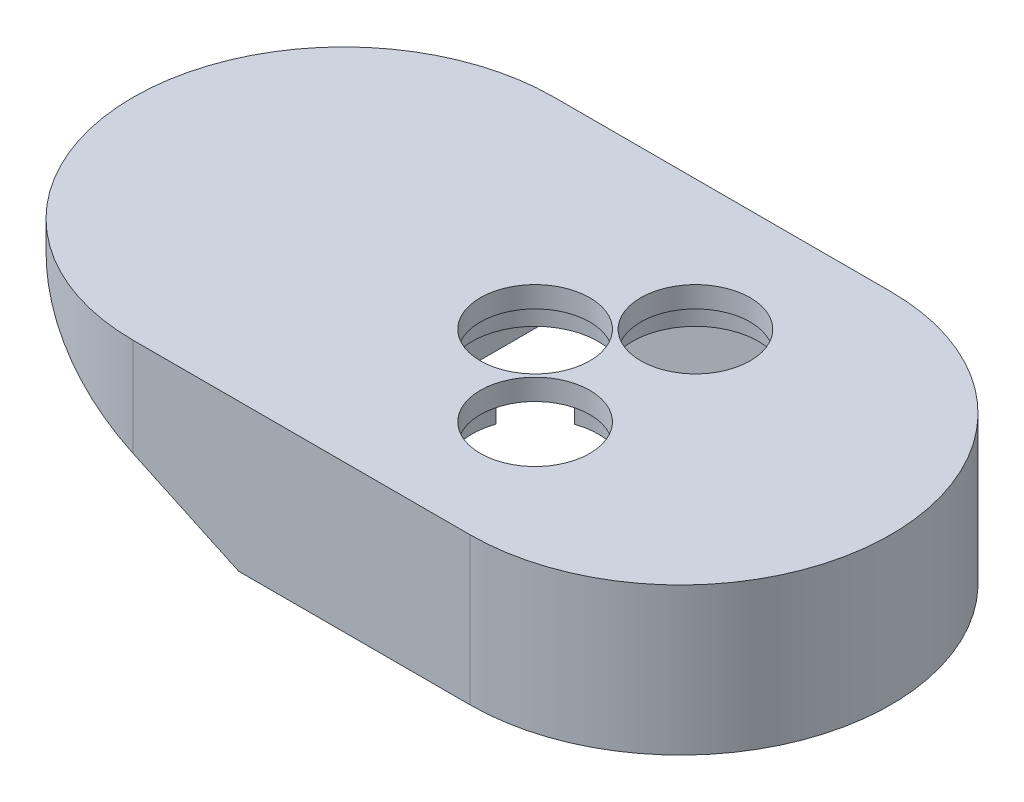
ISO-10303-21;
HEADER;
FILE_DESCRIPTION(('STEP AP214'),'2;1');
FILE_NAME('part.step','',(''),(''),'','','');
FILE_SCHEMA(('AUTOMOTIVE_DESIGN { 1 0 10303 214 1 1 1 1 }'));
ENDSEC;
DATA;
#1=APPLICATION_CONTEXT('core data for automotive mechanical design processes');
#2=APPLICATION_PROTOCOL_DEFINITION('international standard','automotive_design',2000,#1);
#3=PRODUCT_CONTEXT('',#1,'mechanical');
#4=PRODUCT('Part','Part','',(#3));
#5=PRODUCT_RELATED_PRODUCT_CATEGORY('part','',(#4));
#6=PRODUCT_DEFINITION_FORMATION('','',#4);
#7=PRODUCT_DEFINITION_CONTEXT('part definition',#1,'design');
#8=PRODUCT_DEFINITION('design','',#6,#7);
#9=PRODUCT_DEFINITION_SHAPE('','',#8);
#10=(LENGTH_UNIT() NAMED_UNIT(*) SI_UNIT(.MILLI.,.METRE.));
#11=(NAMED_UNIT(*) PLANE_ANGLE_UNIT() SI_UNIT($,.RADIAN.));
#12=(NAMED_UNIT(*) SI_UNIT($,.STERADIAN.) SOLID_ANGLE_UNIT());
#13=UNCERTAINTY_MEASURE_WITH_UNIT(LENGTH_MEASURE(1.E-05),#10,'distance_accuracy_value','');
#14=(GEOMETRIC_REPRESENTATION_CONTEXT(3) GLOBAL_UNCERTAINTY_ASSIGNED_CONTEXT((#13)) GLOBAL_UNIT_ASSIGNED_CONTEXT((#10,
#11,#12)) REPRESENTATION_CONTEXT('',''));
#15=CARTESIAN_POINT('',(0.,0.,0.));
#16=DIRECTION('',(0.,0.,1.));
#17=DIRECTION('',(1.,0.,0.));
#18=AXIS2_PLACEMENT_3D('',#15,#16,#17);
#19=CARTESIAN_POINT('',(0.,2.,-10.));
#20=DIRECTION('',(0.,0.,1.));
#21=DIRECTION('',(1.,0.,0.));
#22=AXIS2_PLACEMENT_3D('',#19,#20,#21);
#23=PLANE('',#22);
#24=DIRECTION('',(0.906307787036651,-0.422618261740697,0.));
#25=VECTOR('',#24,1.);
#26=CARTESIAN_POINT('',(-3.87771663095597,-8.31579015086013,-10.));
#27=LINE('',#26,#25);
#28=CARTESIAN_POINT('',(-16.,-2.66307658154996,-10.));
#29=VERTEX_POINT('',#28);
#30=CARTESIAN_POINT('',(-10.988451556433,-5.,-10.));
#31=VERTEX_POINT('',#30);
#32=EDGE_CURVE('E149',#29,#31,#27,.T.);
#33=ORIENTED_EDGE('',*,*,#32,.F.);
#34=DIRECTION('',(0.,1.,0.));
#35=VECTOR('',#34,1.);
#36=CARTESIAN_POINT('',(-16.,-35.6668415320195,-10.));
#37=LINE('',#36,#35);
#38=CARTESIAN_POINT('',(-16.,2.,-10.));
#39=VERTEX_POINT('',#38);
#40=EDGE_CURVE('E189',#29,#39,#37,.T.);
#41=ORIENTED_EDGE('',*,*,#40,.T.);
#42=DIRECTION('',(-1.,0.,0.));
#43=VECTOR('',#42,1.);
#44=CARTESIAN_POINT('',(0.,2.,-10.));
#45=LINE('',#44,#43);
#46=CARTESIAN_POINT('',(0.,2.,-10.));
#47=VERTEX_POINT('',#46);
#48=EDGE_CURVE('E273',#47,#39,#45,.T.);
#49=ORIENTED_EDGE('',*,*,#48,.F.);
#50=DIRECTION('',(0.,-1.,0.));
#51=VECTOR('',#50,1.);
#52=CARTESIAN_POINT('',(0.,2.,-10.));
#53=LINE('',#52,#51);
#54=CARTESIAN_POINT('',(0.,-5.,-10.));
#55=VERTEX_POINT('',#54);
#56=EDGE_CURVE('E12',#47,#55,#53,.T.);
#57=ORIENTED_EDGE('',*,*,#56,.T.);
#58=DIRECTION('',(1.,0.,0.));
#59=VECTOR('',#58,1.);
#60=CARTESIAN_POINT('',(-10.,-5.,-10.));
#61=LINE('',#60,#59);
#62=EDGE_CURVE('E147',#31,#55,#61,.T.);
#63=ORIENTED_EDGE('',*,*,#62,.F.);
#64=EDGE_LOOP('',(#33,#41,#49,#57,#63));
#65=FACE_BOUND('',#64,.T.);
#66=ADVANCED_FACE('F43',(#65),#23,.F.);
#67=CARTESIAN_POINT('',(0.,2.,10.));
#68=DIRECTION('',(0.,0.,-1.));
#69=DIRECTION('',(-1.,0.,0.));
#70=AXIS2_PLACEMENT_3D('',#67,#68,#69);
#71=PLANE('',#70);
#72=DIRECTION('',(0.906307787036651,-0.422618261740697,0.));
#73=VECTOR('',#72,1.);
#74=CARTESIAN_POINT('',(-3.87771663095597,-8.31579015086013,10.));
#75=LINE('',#74,#73);
#76=CARTESIAN_POINT('',(-16.,-2.66307658154996,10.));
#77=VERTEX_POINT('',#76);
#78=CARTESIAN_POINT('',(-10.988451556433,-5.,10.));
#79=VERTEX_POINT('',#78);
#80=EDGE_CURVE('E166',#77,#79,#75,.T.);
#81=ORIENTED_EDGE('',*,*,#80,.T.);
#82=DIRECTION('',(-1.,0.,0.));
#83=VECTOR('',#82,1.);
#84=CARTESIAN_POINT('',(0.,-5.,10.));
#85=LINE('',#84,#83);
#86=CARTESIAN_POINT('',(0.,-5.,10.));
#87=VERTEX_POINT('',#86);
#88=EDGE_CURVE('E156',#87,#79,#85,.T.);
#89=ORIENTED_EDGE('',*,*,#88,.F.);
#90=DIRECTION('',(0.,-1.,0.));
#91=VECTOR('',#90,1.);
#92=CARTESIAN_POINT('',(0.,2.,10.));
#93=LINE('',#92,#91);
#94=CARTESIAN_POINT('',(0.,2.,10.));
#95=VERTEX_POINT('',#94);
#96=EDGE_CURVE('E51',#95,#87,#93,.T.);
#97=ORIENTED_EDGE('',*,*,#96,.F.);
#98=DIRECTION('',(1.,0.,0.));
#99=VECTOR('',#98,1.);
#100=CARTESIAN_POINT('',(0.,2.,10.));
#101=LINE('',#100,#99);
#102=CARTESIAN_POINT('',(-16.,2.,10.));
#103=VERTEX_POINT('',#102);
#104=EDGE_CURVE('E276',#103,#95,#101,.T.);
#105=ORIENTED_EDGE('',*,*,#104,.F.);
#106=DIRECTION('',(0.,1.,0.));
#107=VECTOR('',#106,1.);
#108=CARTESIAN_POINT('',(-16.,-35.6668415320195,10.));
#109=LINE('',#108,#107);
#110=EDGE_CURVE('E190',#77,#103,#109,.T.);
#111=ORIENTED_EDGE('',*,*,#110,.F.);
#112=EDGE_LOOP('',(#81,#89,#97,#105,#111));
#113=FACE_BOUND('',#112,.T.);
#114=ADVANCED_FACE('F284',(#113),#71,.F.);
#115=CARTESIAN_POINT('',(0.,-5.,0.));
#116=DIRECTION('',(0.,-1.,0.));
#117=DIRECTION('',(0.,0.,-1.));
#118=AXIS2_PLACEMENT_3D('',#115,#116,#117);
#119=PLANE('',#118);
#120=DIRECTION('',(0.,0.,1.));
#121=VECTOR('',#120,1.);
#122=CARTESIAN_POINT('',(3.,-5.,8.));
#123=LINE('',#122,#121);
#124=CARTESIAN_POINT('',(3.00000000000001,-5.,-8.));
#125=VERTEX_POINT('',#124);
#126=CARTESIAN_POINT('',(3.,-5.,8.));
#127=VERTEX_POINT('',#126);
#128=EDGE_CURVE('E195',#125,#127,#123,.T.);
#129=ORIENTED_EDGE('',*,*,#128,.F.);
#130=DIRECTION('',(1.,0.,0.));
#131=VECTOR('',#130,1.);
#132=CARTESIAN_POINT('',(-13.,-5.,-8.));
#133=LINE('',#132,#131);
#134=CARTESIAN_POINT('',(-10.988451556433,-5.,-8.));
#135=VERTEX_POINT('',#134);
#136=EDGE_CURVE('E171',#135,#125,#133,.T.);
#137=ORIENTED_EDGE('',*,*,#136,.F.);
#138=DIRECTION('',(0.,0.,1.));
#139=VECTOR('',#138,1.);
#140=CARTESIAN_POINT('',(-10.988451556433,-5.,-10.));
#141=LINE('',#140,#139);
#142=EDGE_CURVE('E161',#31,#135,#141,.T.);
#143=ORIENTED_EDGE('',*,*,#142,.F.);
#144=ORIENTED_EDGE('',*,*,#62,.T.);
#145=CARTESIAN_POINT('',(0.,-5.,0.));
#146=DIRECTION('',(0.,-1.,0.));
#147=DIRECTION('',(0.,0.,-1.));
#148=AXIS2_PLACEMENT_3D('',#145,#146,#147);
#149=CIRCLE('',#148,10.);
#150=EDGE_CURVE('E219',#55,#87,#149,.T.);
#151=ORIENTED_EDGE('',*,*,#150,.T.);
#152=ORIENTED_EDGE('',*,*,#88,.T.);
#153=CARTESIAN_POINT('',(-10.988451556433,-5.,8.));
#154=VERTEX_POINT('',#153);
#155=EDGE_CURVE('E165',#154,#79,#141,.T.);
#156=ORIENTED_EDGE('',*,*,#155,.F.);
#157=DIRECTION('',(-1.,0.,0.));
#158=VECTOR('',#157,1.);
#159=CARTESIAN_POINT('',(-13.,-5.,8.));
#160=LINE('',#159,#158);
#161=EDGE_CURVE('E197',#127,#154,#160,.T.);
#162=ORIENTED_EDGE('',*,*,#161,.F.);
#163=EDGE_LOOP('',(#129,#137,#143,#144,#151,#152,#156,#162));
#164=FACE_BOUND('',#163,.T.);
#165=ADVANCED_FACE('F170',(#164),#119,.T.);
#166=CARTESIAN_POINT('',(-13.,-5.,8.));
#167=DIRECTION('',(0.,0.,-1.));
#168=DIRECTION('',(-1.,0.,0.));
#169=AXIS2_PLACEMENT_3D('',#166,#167,#168);
#170=PLANE('',#169);
#171=ORIENTED_EDGE('',*,*,#161,.T.);
#172=DIRECTION('',(-0.906307787036651,0.422618261740697,0.));
#173=VECTOR('',#172,1.);
#174=CARTESIAN_POINT('',(-12.6407249861211,-4.22953224637044,8.));
#175=LINE('',#174,#173);
#176=CARTESIAN_POINT('',(-13.,-4.06199955601494,8.));
#177=VERTEX_POINT('',#176);
#178=EDGE_CURVE('E182',#154,#177,#175,.T.);
#179=ORIENTED_EDGE('',*,*,#178,.T.);
#180=DIRECTION('',(0.,1.,0.));
#181=VECTOR('',#180,1.);
#182=CARTESIAN_POINT('',(-13.,-5.,8.));
#183=LINE('',#182,#181);
#184=CARTESIAN_POINT('',(-13.,0.,8.));
#185=VERTEX_POINT('',#184);
#186=EDGE_CURVE('E214',#177,#185,#183,.T.);
#187=ORIENTED_EDGE('',*,*,#186,.T.);
#188=DIRECTION('',(-1.,0.,0.));
#189=VECTOR('',#188,1.);
#190=CARTESIAN_POINT('',(-13.,0.,8.));
#191=LINE('',#190,#189);
#192=CARTESIAN_POINT('',(3.,0.,8.));
#193=VERTEX_POINT('',#192);
#194=EDGE_CURVE('E203',#193,#185,#191,.T.);
#195=ORIENTED_EDGE('',*,*,#194,.F.);
#196=DIRECTION('',(0.,1.,0.));
#197=VECTOR('',#196,1.);
#198=CARTESIAN_POINT('',(3.,-5.,8.));
#199=LINE('',#198,#197);
#200=EDGE_CURVE('E216',#127,#193,#199,.T.);
#201=ORIENTED_EDGE('',*,*,#200,.F.);
#202=EDGE_LOOP('',(#171,#179,#187,#195,#201));
#203=FACE_BOUND('',#202,.T.);
#204=ADVANCED_FACE('F292',(#203),#170,.T.);
#205=CARTESIAN_POINT('',(-13.,-5.,8.));
#206=DIRECTION('',(1.,0.,0.));
#207=DIRECTION('',(0.,0.,-1.));
#208=AXIS2_PLACEMENT_3D('',#205,#206,#207);
#209=PLANE('',#208);
#210=ORIENTED_EDGE('',*,*,#186,.F.);
#211=DIRECTION('',(0.,0.,-1.));
#212=VECTOR('',#211,1.);
#213=CARTESIAN_POINT('',(-13.,-4.06199955601494,8.));
#214=LINE('',#213,#212);
#215=CARTESIAN_POINT('',(-13.,-4.06199955601495,-8.));
#216=VERTEX_POINT('',#215);
#217=EDGE_CURVE('E179',#177,#216,#214,.T.);
#218=ORIENTED_EDGE('',*,*,#217,.T.);
#219=DIRECTION('',(0.,1.,0.));
#220=VECTOR('',#219,1.);
#221=CARTESIAN_POINT('',(-13.,-5.,-8.));
#222=LINE('',#221,#220);
#223=CARTESIAN_POINT('',(-13.,0.,-8.));
#224=VERTEX_POINT('',#223);
#225=EDGE_CURVE('E212',#216,#224,#222,.T.);
#226=ORIENTED_EDGE('',*,*,#225,.T.);
#227=DIRECTION('',(0.,0.,-1.));
#228=VECTOR('',#227,1.);
#229=CARTESIAN_POINT('',(-13.,0.,8.));
#230=LINE('',#229,#228);
#231=EDGE_CURVE('E206',#185,#224,#230,.T.);
#232=ORIENTED_EDGE('',*,*,#231,.F.);
#233=EDGE_LOOP('',(#210,#218,#226,#232));
#234=FACE_BOUND('',#233,.T.);
#235=ADVANCED_FACE('F296',(#234),#209,.T.);
#236=CARTESIAN_POINT('',(-13.,-5.,-8.));
#237=DIRECTION('',(0.,0.,1.));
#238=DIRECTION('',(1.,0.,0.));
#239=AXIS2_PLACEMENT_3D('',#236,#237,#238);
#240=PLANE('',#239);
#241=ORIENTED_EDGE('',*,*,#225,.F.);
#242=DIRECTION('',(0.906307787036651,-0.422618261740697,0.));
#243=VECTOR('',#242,1.);
#244=CARTESIAN_POINT('',(-12.6407249861211,-4.22953224637044,-8.));
#245=LINE('',#244,#243);
#246=EDGE_CURVE('E177',#216,#135,#245,.T.);
#247=ORIENTED_EDGE('',*,*,#246,.T.);
#248=ORIENTED_EDGE('',*,*,#136,.T.);
#249=DIRECTION('',(0.,1.,0.));
#250=VECTOR('',#249,1.);
#251=CARTESIAN_POINT('',(3.00000000000001,-5.,-8.));
#252=LINE('',#251,#250);
#253=CARTESIAN_POINT('',(3.00000000000001,0.,-8.));
#254=VERTEX_POINT('',#253);
#255=EDGE_CURVE('E58',#125,#254,#252,.T.);
#256=ORIENTED_EDGE('',*,*,#255,.T.);
#257=DIRECTION('',(1.,0.,0.));
#258=VECTOR('',#257,1.);
#259=CARTESIAN_POINT('',(-13.,0.,-8.));
#260=LINE('',#259,#258);
#261=EDGE_CURVE('E198',#224,#254,#260,.T.);
#262=ORIENTED_EDGE('',*,*,#261,.F.);
#263=EDGE_LOOP('',(#241,#247,#248,#256,#262));
#264=FACE_BOUND('',#263,.T.);
#265=ADVANCED_FACE('F303',(#264),#240,.T.);
#266=CARTESIAN_POINT('',(-16.,-35.6668415320195,0.));
#267=DIRECTION('',(0.,1.,0.));
#268=DIRECTION('',(0.,0.,1.));
#269=AXIS2_PLACEMENT_3D('',#266,#267,#268);
#270=CYLINDRICAL_SURFACE('',#269,10.);
#271=CARTESIAN_POINT('',(-16.,2.,0.));
#272=DIRECTION('',(0.,1.,0.));
#273=DIRECTION('',(0.,0.,1.));
#274=AXIS2_PLACEMENT_3D('',#271,#272,#273);
#275=CIRCLE('',#274,10.);
#276=CARTESIAN_POINT('',(-26.,1.99999999999999,0.));
#277=VERTEX_POINT('',#276);
#278=EDGE_CURVE('E185',#277,#103,#275,.T.);
#279=ORIENTED_EDGE('',*,*,#278,.F.);
#280=CARTESIAN_POINT('',(-16.,-2.66307658154996,0.));
#281=DIRECTION('',(-0.422618261740697,-0.906307787036651,0.));
#282=DIRECTION('',(-0.906307787036651,0.422618261740697,0.));
#283=AXIS2_PLACEMENT_3D('',#280,#281,#282);
#284=ELLIPSE('',#283,11.0337791896249,10.);
#285=EDGE_CURVE('E173',#277,#77,#284,.F.);
#286=ORIENTED_EDGE('',*,*,#285,.T.);
#287=ORIENTED_EDGE('',*,*,#110,.T.);
#288=EDGE_LOOP('',(#279,#286,#287));
#289=FACE_BOUND('',#288,.T.);
#290=ADVANCED_FACE('F305',(#289),#270,.T.);
#291=ORIENTED_EDGE('',*,*,#40,.F.);
#292=EDGE_CURVE('E164',#29,#277,#284,.F.);
#293=ORIENTED_EDGE('',*,*,#292,.T.);
#294=EDGE_CURVE('E186',#39,#277,#275,.T.);
#295=ORIENTED_EDGE('',*,*,#294,.F.);
#296=EDGE_LOOP('',(#291,#293,#295));
#297=FACE_BOUND('',#296,.T.);
#298=ADVANCED_FACE('F311',(#297),#270,.T.);
#299=CARTESIAN_POINT('',(-3.095,2.,3.80999999999999));
#300=DIRECTION('',(0.,-1.,0.));
#301=DIRECTION('',(0.,0.,-1.));
#302=AXIS2_PLACEMENT_3D('',#299,#300,#301);
#303=CYLINDRICAL_SURFACE('',#302,2.6);
#304=CARTESIAN_POINT('',(-3.095,2.,3.80999999999999));
#305=DIRECTION('',(0.,1.,0.));
#306=DIRECTION('',(0.,0.,1.));
#307=AXIS2_PLACEMENT_3D('',#304,#305,#306);
#308=CIRCLE('',#307,2.6);
#309=CARTESIAN_POINT('',(-3.095,2.,6.40999999999999));
#310=VERTEX_POINT('',#309);
#311=EDGE_CURVE('E267',#310,#310,#308,.T.);
#312=ORIENTED_EDGE('',*,*,#311,.T.);
#313=EDGE_LOOP('',(#312));
#314=FACE_BOUND('',#313,.T.);
#315=CARTESIAN_POINT('',(-3.095,1.,3.80999999999999));
#316=DIRECTION('',(0.,-1.,0.));
#317=DIRECTION('',(0.,0.,-1.));
#318=AXIS2_PLACEMENT_3D('',#315,#316,#317);
#319=CIRCLE('',#318,2.6);
#320=CARTESIAN_POINT('',(-3.095,1.,1.20999999999999));
#321=VERTEX_POINT('',#320);
#322=EDGE_CURVE('E229',#321,#321,#319,.F.);
#323=ORIENTED_EDGE('',*,*,#322,.F.);
#324=EDGE_LOOP('',(#323));
#325=FACE_BOUND('',#324,.T.);
#326=ADVANCED_FACE('F329',(#314,#325),#303,.F.);
#327=CARTESIAN_POINT('',(-3.095,2.,-3.81000000000001));
#328=DIRECTION('',(0.,-1.,0.));
#329=DIRECTION('',(0.,0.,-1.));
#330=AXIS2_PLACEMENT_3D('',#327,#328,#329);
#331=CYLINDRICAL_SURFACE('',#330,2.6);
#332=CARTESIAN_POINT('',(-3.095,2.,-3.81000000000001));
#333=DIRECTION('',(0.,1.,0.));
#334=DIRECTION('',(0.,0.,1.));
#335=AXIS2_PLACEMENT_3D('',#332,#333,#334);
#336=CIRCLE('',#335,2.6);
#337=CARTESIAN_POINT('',(-3.095,2.,-1.21000000000001));
#338=VERTEX_POINT('',#337);
#339=EDGE_CURVE('E264',#338,#338,#336,.T.);
#340=ORIENTED_EDGE('',*,*,#339,.T.);
#341=EDGE_LOOP('',(#340));
#342=FACE_BOUND('',#341,.T.);
#343=CARTESIAN_POINT('',(-3.095,1.,-3.81000000000001));
#344=DIRECTION('',(0.,-1.,0.));
#345=DIRECTION('',(0.,0.,-1.));
#346=AXIS2_PLACEMENT_3D('',#343,#344,#345);
#347=CIRCLE('',#346,2.6);
#348=CARTESIAN_POINT('',(-3.095,1.,-6.41000000000001));
#349=VERTEX_POINT('',#348);
#350=EDGE_CURVE('E222',#349,#349,#347,.F.);
#351=ORIENTED_EDGE('',*,*,#350,.F.);
#352=EDGE_LOOP('',(#351));
#353=FACE_BOUND('',#352,.T.);
#354=ADVANCED_FACE('F332',(#342,#353),#331,.F.);
#355=CARTESIAN_POINT('',(-6.905,2.,0.));
#356=DIRECTION('',(0.,-1.,0.));
#357=DIRECTION('',(0.,0.,-1.));
#358=AXIS2_PLACEMENT_3D('',#355,#356,#357);
#359=CYLINDRICAL_SURFACE('',#358,2.6);
#360=CARTESIAN_POINT('',(-6.905,2.,0.));
#361=DIRECTION('',(0.,1.,0.));
#362=DIRECTION('',(0.,0.,1.));
#363=AXIS2_PLACEMENT_3D('',#360,#361,#362);
#364=CIRCLE('',#363,2.6);
#365=CARTESIAN_POINT('',(-6.905,2.,2.60000000000001));
#366=VERTEX_POINT('',#365);
#367=EDGE_CURVE('E256',#366,#366,#364,.T.);
#368=ORIENTED_EDGE('',*,*,#367,.T.);
#369=EDGE_LOOP('',(#368));
#370=FACE_BOUND('',#369,.T.);
#371=CARTESIAN_POINT('',(-6.905,1.,0.));
#372=DIRECTION('',(0.,-1.,0.));
#373=DIRECTION('',(0.,0.,-1.));
#374=AXIS2_PLACEMENT_3D('',#371,#372,#373);
#375=CIRCLE('',#374,2.6);
#376=CARTESIAN_POINT('',(-6.905,1.,-2.59999999999999));
#377=VERTEX_POINT('',#376);
#378=EDGE_CURVE('E225',#377,#377,#375,.F.);
#379=ORIENTED_EDGE('',*,*,#378,.F.);
#380=EDGE_LOOP('',(#379));
#381=FACE_BOUND('',#380,.T.);
#382=ADVANCED_FACE('F327',(#370,#381),#359,.F.);
#383=CARTESIAN_POINT('',(0.,2.,0.));
#384=DIRECTION('',(0.,1.,0.));
#385=DIRECTION('',(0.,0.,1.));
#386=AXIS2_PLACEMENT_3D('',#383,#384,#385);
#387=PLANE('',#386);
#388=ORIENTED_EDGE('',*,*,#339,.F.);
#389=EDGE_LOOP('',(#388));
#390=FACE_BOUND('',#389,.T.);
#391=CARTESIAN_POINT('',(0.,2.,0.));
#392=DIRECTION('',(0.,1.,0.));
#393=DIRECTION('',(0.,0.,1.));
#394=AXIS2_PLACEMENT_3D('',#391,#392,#393);
#395=CIRCLE('',#394,10.);
#396=EDGE_CURVE('E270',#95,#47,#395,.T.);
#397=ORIENTED_EDGE('',*,*,#396,.T.);
#398=ORIENTED_EDGE('',*,*,#48,.T.);
#399=ORIENTED_EDGE('',*,*,#294,.T.);
#400=ORIENTED_EDGE('',*,*,#278,.T.);
#401=ORIENTED_EDGE('',*,*,#104,.T.);
#402=EDGE_LOOP('',(#397,#398,#399,#400,#401));
#403=FACE_BOUND('',#402,.T.);
#404=ORIENTED_EDGE('',*,*,#311,.F.);
#405=EDGE_LOOP('',(#404));
#406=FACE_BOUND('',#405,.T.);
#407=ORIENTED_EDGE('',*,*,#367,.F.);
#408=EDGE_LOOP('',(#407));
#409=FACE_BOUND('',#408,.T.);
#410=ADVANCED_FACE('F324',(#390,#403,#406,#409),#387,.T.);
#411=CARTESIAN_POINT('',(0.,0.,0.));
#412=DIRECTION('',(0.,1.,0.));
#413=DIRECTION('',(0.,0.,1.));
#414=AXIS2_PLACEMENT_3D('',#411,#412,#413);
#415=PLANE('',#414);
#416=ORIENTED_EDGE('',*,*,#261,.T.);
#417=DIRECTION('',(0.,0.,1.));
#418=VECTOR('',#417,1.);
#419=CARTESIAN_POINT('',(3.,0.,8.));
#420=LINE('',#419,#418);
#421=EDGE_CURVE('E193',#254,#193,#420,.T.);
#422=ORIENTED_EDGE('',*,*,#421,.T.);
#423=ORIENTED_EDGE('',*,*,#194,.T.);
#424=ORIENTED_EDGE('',*,*,#231,.T.);
#425=EDGE_LOOP('',(#416,#422,#423,#424));
#426=FACE_BOUND('',#425,.T.);
#427=CARTESIAN_POINT('',(-3.095,0.,-3.81000000000001));
#428=DIRECTION('',(0.,-1.,0.));
#429=DIRECTION('',(0.,0.,-1.));
#430=AXIS2_PLACEMENT_3D('',#427,#428,#429);
#431=CIRCLE('',#430,3.);
#432=CARTESIAN_POINT('',(-5.93326041381813,0.,-2.83826041381813));
#433=VERTEX_POINT('',#432);
#434=CARTESIAN_POINT('',(-4.06673958618187,0.,-0.971739586181873));
#435=VERTEX_POINT('',#434);
#436=EDGE_CURVE('E246',#433,#435,#431,.T.);
#437=ORIENTED_EDGE('',*,*,#436,.F.);
#438=CARTESIAN_POINT('',(-6.905,0.,0.));
#439=DIRECTION('',(0.,-1.,0.));
#440=DIRECTION('',(0.,0.,-1.));
#441=AXIS2_PLACEMENT_3D('',#438,#439,#440);
#442=CIRCLE('',#441,3.);
#443=CARTESIAN_POINT('',(-5.93326041381814,0.,2.83826041381815));
#444=VERTEX_POINT('',#443);
#445=EDGE_CURVE('E66',#444,#433,#442,.T.);
#446=ORIENTED_EDGE('',*,*,#445,.F.);
#447=CARTESIAN_POINT('',(-3.095,0.,3.80999999999999));
#448=DIRECTION('',(0.,-1.,0.));
#449=DIRECTION('',(0.,0.,-1.));
#450=AXIS2_PLACEMENT_3D('',#447,#448,#449);
#451=CIRCLE('',#450,3.);
#452=CARTESIAN_POINT('',(-4.06673958618186,0.,0.971739586181853));
#453=VERTEX_POINT('',#452);
#454=EDGE_CURVE('E226',#453,#444,#451,.T.);
#455=ORIENTED_EDGE('',*,*,#454,.F.);
#456=CARTESIAN_POINT('',(-6.905,0.,0.));
#457=DIRECTION('',(0.,-1.,0.));
#458=DIRECTION('',(0.,0.,-1.));
#459=AXIS2_PLACEMENT_3D('',#456,#457,#458);
#460=CIRCLE('',#459,3.);
#461=EDGE_CURVE('E249',#435,#453,#460,.T.);
#462=ORIENTED_EDGE('',*,*,#461,.F.);
#463=EDGE_LOOP('',(#437,#446,#455,#462));
#464=FACE_BOUND('',#463,.T.);
#465=ADVANCED_FACE('F299',(#426,#464),#415,.F.);
#466=CARTESIAN_POINT('',(0.,2.,0.));
#467=DIRECTION('',(0.,-1.,0.));
#468=DIRECTION('',(0.,0.,-1.));
#469=AXIS2_PLACEMENT_3D('',#466,#467,#468);
#470=CYLINDRICAL_SURFACE('',#469,10.);
#471=ORIENTED_EDGE('',*,*,#96,.T.);
#472=ORIENTED_EDGE('',*,*,#150,.F.);
#473=ORIENTED_EDGE('',*,*,#56,.F.);
#474=ORIENTED_EDGE('',*,*,#396,.F.);
#475=EDGE_LOOP('',(#471,#472,#473,#474));
#476=FACE_BOUND('',#475,.T.);
#477=ADVANCED_FACE('F45',(#476),#470,.T.);
#478=CARTESIAN_POINT('',(-6.905,1.,0.));
#479=DIRECTION('',(0.,-1.,0.));
#480=DIRECTION('',(0.,0.,-1.));
#481=AXIS2_PLACEMENT_3D('',#478,#479,#480);
#482=CYLINDRICAL_SURFACE('',#481,3.);
#483=ORIENTED_EDGE('',*,*,#445,.T.);
#484=DIRECTION('',(0.,-1.,0.));
#485=VECTOR('',#484,1.);
#486=CARTESIAN_POINT('',(-5.93326041381813,1.,-2.83826041381813));
#487=LINE('',#486,#485);
#488=CARTESIAN_POINT('',(-5.93326041381813,1.,-2.83826041381813));
#489=VERTEX_POINT('',#488);
#490=EDGE_CURVE('E244',#489,#433,#487,.T.);
#491=ORIENTED_EDGE('',*,*,#490,.F.);
#492=CARTESIAN_POINT('',(-6.905,1.,0.));
#493=DIRECTION('',(0.,-1.,0.));
#494=DIRECTION('',(0.,0.,-1.));
#495=AXIS2_PLACEMENT_3D('',#492,#493,#494);
#496=CIRCLE('',#495,3.);
#497=CARTESIAN_POINT('',(-5.93326041381814,1.,2.83826041381815));
#498=VERTEX_POINT('',#497);
#499=EDGE_CURVE('E232',#498,#489,#496,.T.);
#500=ORIENTED_EDGE('',*,*,#499,.F.);
#501=DIRECTION('',(0.,-1.,0.));
#502=VECTOR('',#501,1.);
#503=CARTESIAN_POINT('',(-5.93326041381814,1.,2.83826041381815));
#504=LINE('',#503,#502);
#505=EDGE_CURVE('E254',#498,#444,#504,.T.);
#506=ORIENTED_EDGE('',*,*,#505,.T.);
#507=EDGE_LOOP('',(#483,#491,#500,#506));
#508=FACE_BOUND('',#507,.T.);
#509=ADVANCED_FACE('F340',(#508),#482,.F.);
#510=CARTESIAN_POINT('',(-3.095,1.,3.80999999999999));
#511=DIRECTION('',(0.,-1.,0.));
#512=DIRECTION('',(0.,0.,-1.));
#513=AXIS2_PLACEMENT_3D('',#510,#511,#512);
#514=CYLINDRICAL_SURFACE('',#513,3.);
#515=ORIENTED_EDGE('',*,*,#454,.T.);
#516=ORIENTED_EDGE('',*,*,#505,.F.);
#517=CARTESIAN_POINT('',(-3.095,1.,3.80999999999999));
#518=DIRECTION('',(0.,-1.,0.));
#519=DIRECTION('',(0.,0.,-1.));
#520=AXIS2_PLACEMENT_3D('',#517,#518,#519);
#521=CIRCLE('',#520,3.);
#522=CARTESIAN_POINT('',(-4.06673958618186,1.,0.971739586181853));
#523=VERTEX_POINT('',#522);
#524=EDGE_CURVE('E241',#523,#498,#521,.T.);
#525=ORIENTED_EDGE('',*,*,#524,.F.);
#526=DIRECTION('',(0.,-1.,0.));
#527=VECTOR('',#526,1.);
#528=CARTESIAN_POINT('',(-4.06673958618186,1.,0.971739586181853));
#529=LINE('',#528,#527);
#530=EDGE_CURVE('E257',#523,#453,#529,.T.);
#531=ORIENTED_EDGE('',*,*,#530,.T.);
#532=EDGE_LOOP('',(#515,#516,#525,#531));
#533=FACE_BOUND('',#532,.T.);
#534=ADVANCED_FACE('F343',(#533),#514,.F.);
#535=CARTESIAN_POINT('',(-6.905,1.,0.));
#536=DIRECTION('',(0.,-1.,0.));
#537=DIRECTION('',(0.,0.,-1.));
#538=AXIS2_PLACEMENT_3D('',#535,#536,#537);
#539=CYLINDRICAL_SURFACE('',#538,3.);
#540=ORIENTED_EDGE('',*,*,#461,.T.);
#541=ORIENTED_EDGE('',*,*,#530,.F.);
#542=CARTESIAN_POINT('',(-6.905,1.,0.));
#543=DIRECTION('',(0.,-1.,0.));
#544=DIRECTION('',(0.,0.,-1.));
#545=AXIS2_PLACEMENT_3D('',#542,#543,#544);
#546=CIRCLE('',#545,3.);
#547=CARTESIAN_POINT('',(-4.06673958618187,1.,-0.971739586181873));
#548=VERTEX_POINT('',#547);
#549=EDGE_CURVE('E238',#548,#523,#546,.T.);
#550=ORIENTED_EDGE('',*,*,#549,.F.);
#551=DIRECTION('',(0.,-1.,0.));
#552=VECTOR('',#551,1.);
#553=CARTESIAN_POINT('',(-4.06673958618187,1.,-0.971739586181873));
#554=LINE('',#553,#552);
#555=EDGE_CURVE('E259',#548,#435,#554,.T.);
#556=ORIENTED_EDGE('',*,*,#555,.T.);
#557=EDGE_LOOP('',(#540,#541,#550,#556));
#558=FACE_BOUND('',#557,.T.);
#559=ADVANCED_FACE('F348',(#558),#539,.F.);
#560=CARTESIAN_POINT('',(-3.095,1.,-3.81000000000001));
#561=DIRECTION('',(0.,-1.,0.));
#562=DIRECTION('',(0.,0.,-1.));
#563=AXIS2_PLACEMENT_3D('',#560,#561,#562);
#564=CYLINDRICAL_SURFACE('',#563,3.);
#565=ORIENTED_EDGE('',*,*,#436,.T.);
#566=ORIENTED_EDGE('',*,*,#555,.F.);
#567=CARTESIAN_POINT('',(-3.095,1.,-3.81000000000001));
#568=DIRECTION('',(0.,-1.,0.));
#569=DIRECTION('',(0.,0.,-1.));
#570=AXIS2_PLACEMENT_3D('',#567,#568,#569);
#571=CIRCLE('',#570,3.);
#572=EDGE_CURVE('E235',#489,#548,#571,.T.);
#573=ORIENTED_EDGE('',*,*,#572,.F.);
#574=ORIENTED_EDGE('',*,*,#490,.T.);
#575=EDGE_LOOP('',(#565,#566,#573,#574));
#576=FACE_BOUND('',#575,.T.);
#577=ADVANCED_FACE('F344',(#576),#564,.F.);
#578=CARTESIAN_POINT('',(0.,1.,0.));
#579=DIRECTION('',(0.,-1.,0.));
#580=DIRECTION('',(0.,0.,-1.));
#581=AXIS2_PLACEMENT_3D('',#578,#579,#580);
#582=PLANE('',#581);
#583=ORIENTED_EDGE('',*,*,#350,.T.);
#584=EDGE_LOOP('',(#583));
#585=FACE_BOUND('',#584,.T.);
#586=ORIENTED_EDGE('',*,*,#378,.T.);
#587=EDGE_LOOP('',(#586));
#588=FACE_BOUND('',#587,.T.);
#589=ORIENTED_EDGE('',*,*,#322,.T.);
#590=EDGE_LOOP('',(#589));
#591=FACE_BOUND('',#590,.T.);
#592=ORIENTED_EDGE('',*,*,#499,.T.);
#593=ORIENTED_EDGE('',*,*,#572,.T.);
#594=ORIENTED_EDGE('',*,*,#549,.T.);
#595=ORIENTED_EDGE('',*,*,#524,.T.);
#596=EDGE_LOOP('',(#592,#593,#594,#595));
#597=FACE_BOUND('',#596,.T.);
#598=ADVANCED_FACE('F347',(#585,#588,#591,#597),#582,.T.);
#599=CARTESIAN_POINT('',(3.,-5.,8.));
#600=DIRECTION('',(-1.,0.,0.));
#601=DIRECTION('',(0.,0.,1.));
#602=AXIS2_PLACEMENT_3D('',#599,#600,#601);
#603=PLANE('',#602);
#604=ORIENTED_EDGE('',*,*,#421,.F.);
#605=ORIENTED_EDGE('',*,*,#255,.F.);
#606=ORIENTED_EDGE('',*,*,#128,.T.);
#607=ORIENTED_EDGE('',*,*,#200,.T.);
#608=EDGE_LOOP('',(#604,#605,#606,#607));
#609=FACE_BOUND('',#608,.T.);
#610=ADVANCED_FACE('F302',(#609),#603,.T.);
#611=CARTESIAN_POINT('',(-3.87771663095597,-8.31579015086013,-10.));
#612=DIRECTION('',(-0.422618261740697,-0.906307787036651,0.));
#613=DIRECTION('',(0.906307787036651,-0.422618261740697,0.));
#614=AXIS2_PLACEMENT_3D('',#611,#612,#613);
#615=PLANE('',#614);
#616=ORIENTED_EDGE('',*,*,#155,.T.);
#617=ORIENTED_EDGE('',*,*,#80,.F.);
#618=ORIENTED_EDGE('',*,*,#285,.F.);
#619=ORIENTED_EDGE('',*,*,#292,.F.);
#620=ORIENTED_EDGE('',*,*,#32,.T.);
#621=ORIENTED_EDGE('',*,*,#142,.T.);
#622=ORIENTED_EDGE('',*,*,#246,.F.);
#623=ORIENTED_EDGE('',*,*,#217,.F.);
#624=ORIENTED_EDGE('',*,*,#178,.F.);
#625=EDGE_LOOP('',(#616,#617,#618,#619,#620,#621,#622,#623,#624));
#626=FACE_BOUND('',#625,.T.);
#627=ADVANCED_FACE('F160',(#626),#615,.T.);
#628=CLOSED_SHELL('',(#66,#114,#165,#204,#235,#265,#290,#298,#326,#354,#382,#410,#465,#477,#509,
#534,#559,#577,#598,#610,#627));
#629=MANIFOLD_SOLID_BREP('B2',#628);
#630=ADVANCED_BREP_SHAPE_REPRESENTATION('',(#18,#629),#14);
#631=SHAPE_DEFINITION_REPRESENTATION(#9,#630);
ENDSEC;
END-ISO-10303-21;
